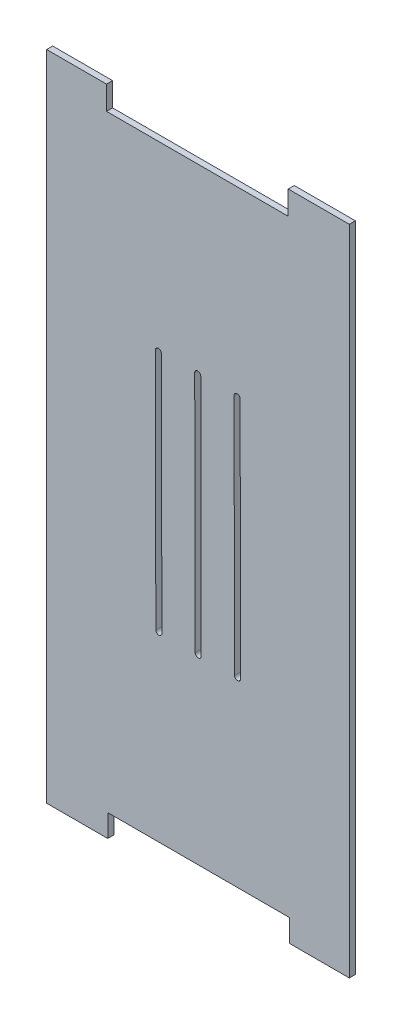
ISO-10303-21;
HEADER;
FILE_DESCRIPTION(('STEP AP214'),'2;1');
FILE_NAME('part.step','',(''),(''),'','','');
FILE_SCHEMA(('AUTOMOTIVE_DESIGN { 1 0 10303 214 1 1 1 1 }'));
ENDSEC;
DATA;
#1=APPLICATION_CONTEXT('core data for automotive mechanical design processes');
#2=APPLICATION_PROTOCOL_DEFINITION('international standard','automotive_design',2000,#1);
#3=PRODUCT_CONTEXT('',#1,'mechanical');
#4=PRODUCT('Part','Part','',(#3));
#5=PRODUCT_RELATED_PRODUCT_CATEGORY('part','',(#4));
#6=PRODUCT_DEFINITION_FORMATION('','',#4);
#7=PRODUCT_DEFINITION_CONTEXT('part definition',#1,'design');
#8=PRODUCT_DEFINITION('design','',#6,#7);
#9=PRODUCT_DEFINITION_SHAPE('','',#8);
#10=(LENGTH_UNIT() NAMED_UNIT(*) SI_UNIT(.MILLI.,.METRE.));
#11=(NAMED_UNIT(*) PLANE_ANGLE_UNIT() SI_UNIT($,.RADIAN.));
#12=(NAMED_UNIT(*) SI_UNIT($,.STERADIAN.) SOLID_ANGLE_UNIT());
#13=UNCERTAINTY_MEASURE_WITH_UNIT(LENGTH_MEASURE(1.E-05),#10,'distance_accuracy_value','');
#14=(GEOMETRIC_REPRESENTATION_CONTEXT(3) GLOBAL_UNCERTAINTY_ASSIGNED_CONTEXT((#13)) GLOBAL_UNIT_ASSIGNED_CONTEXT((#10,
#11,#12)) REPRESENTATION_CONTEXT('',''));
#15=CARTESIAN_POINT('',(0.,0.,0.));
#16=DIRECTION('',(0.,0.,1.));
#17=DIRECTION('',(1.,0.,0.));
#18=AXIS2_PLACEMENT_3D('',#15,#16,#17);
#19=CARTESIAN_POINT('',(0.,0.,5.));
#20=DIRECTION('',(0.,0.,-1.));
#21=DIRECTION('',(-1.,0.,0.));
#22=AXIS2_PLACEMENT_3D('',#19,#20,#21);
#23=PLANE('',#22);
#24=DIRECTION('',(0.00199600400794847,-0.999998007982016,0.));
#25=VECTOR('',#24,1.);
#26=CARTESIAN_POINT('',(235.300404181642,369.49500998998,5.));
#27=LINE('',#26,#25);
#28=CARTESIAN_POINT('',(235.300404181642,369.49500998998,5.));
#29=VERTEX_POINT('',#28);
#30=CARTESIAN_POINT('',(235.699605778448,169.49500998998,5.));
#31=VERTEX_POINT('',#30);
#32=EDGE_CURVE('E390',#29,#31,#27,.T.);
#33=ORIENTED_EDGE('',*,*,#32,.F.);
#34=CARTESIAN_POINT('',(237.800399201597,369.5,5.));
#35=DIRECTION('',(0.,0.,1.));
#36=DIRECTION('',(1.,0.,0.));
#37=AXIS2_PLACEMENT_3D('',#34,#35,#36);
#38=CIRCLE('',#37,2.50000000000006);
#39=CARTESIAN_POINT('',(240.300394221552,369.50499001002,5.));
#40=VERTEX_POINT('',#39);
#41=EDGE_CURVE('E57',#40,#29,#38,.T.);
#42=ORIENTED_EDGE('',*,*,#41,.F.);
#43=DIRECTION('',(0.00199600400794847,-0.999998007982016,0.));
#44=VECTOR('',#43,1.);
#45=CARTESIAN_POINT('',(240.300394221552,369.50499001002,5.));
#46=LINE('',#45,#44);
#47=CARTESIAN_POINT('',(240.699595818358,169.50499001002,5.));
#48=VERTEX_POINT('',#47);
#49=EDGE_CURVE('E397',#40,#48,#46,.T.);
#50=ORIENTED_EDGE('',*,*,#49,.T.);
#51=CARTESIAN_POINT('',(238.199600798403,169.5,5.));
#52=DIRECTION('',(0.,0.,1.));
#53=DIRECTION('',(1.,0.,0.));
#54=AXIS2_PLACEMENT_3D('',#51,#52,#53);
#55=CIRCLE('',#54,2.50000000000006);
#56=EDGE_CURVE('E393',#31,#48,#55,.T.);
#57=ORIENTED_EDGE('',*,*,#56,.F.);
#58=EDGE_LOOP('',(#33,#42,#50,#57));
#59=FACE_BOUND('',#58,.T.);
#60=DIRECTION('',(0.00199600400794847,-0.999998007982016,0.));
#61=VECTOR('',#60,1.);
#62=CARTESIAN_POINT('',(300.300404181642,369.49500998998,5.));
#63=LINE('',#62,#61);
#64=CARTESIAN_POINT('',(300.300404181642,369.49500998998,5.));
#65=VERTEX_POINT('',#64);
#66=CARTESIAN_POINT('',(300.699605778448,169.49500998998,5.));
#67=VERTEX_POINT('',#66);
#68=EDGE_CURVE('E415',#65,#67,#63,.T.);
#69=ORIENTED_EDGE('',*,*,#68,.F.);
#70=CARTESIAN_POINT('',(302.800399201597,369.5,5.));
#71=DIRECTION('',(0.,0.,1.));
#72=DIRECTION('',(1.,0.,0.));
#73=AXIS2_PLACEMENT_3D('',#70,#71,#72);
#74=CIRCLE('',#73,2.50000000000006);
#75=CARTESIAN_POINT('',(305.300394221552,369.50499001002,5.));
#76=VERTEX_POINT('',#75);
#77=EDGE_CURVE('E405',#76,#65,#74,.T.);
#78=ORIENTED_EDGE('',*,*,#77,.F.);
#79=DIRECTION('',(0.00199600400794847,-0.999998007982016,0.));
#80=VECTOR('',#79,1.);
#81=CARTESIAN_POINT('',(305.300394221552,369.50499001002,5.));
#82=LINE('',#81,#80);
#83=CARTESIAN_POINT('',(305.699595818358,169.50499001002,5.));
#84=VERTEX_POINT('',#83);
#85=EDGE_CURVE('E423',#76,#84,#82,.T.);
#86=ORIENTED_EDGE('',*,*,#85,.T.);
#87=CARTESIAN_POINT('',(303.199600798403,169.5,5.));
#88=DIRECTION('',(0.,0.,1.));
#89=DIRECTION('',(1.,0.,0.));
#90=AXIS2_PLACEMENT_3D('',#87,#88,#89);
#91=CIRCLE('',#90,2.50000000000006);
#92=EDGE_CURVE('E419',#67,#84,#91,.T.);
#93=ORIENTED_EDGE('',*,*,#92,.F.);
#94=EDGE_LOOP('',(#69,#78,#86,#93));
#95=FACE_BOUND('',#94,.T.);
#96=DIRECTION('',(0.00199600400794847,-0.999998007982016,0.));
#97=VECTOR('',#96,1.);
#98=CARTESIAN_POINT('',(267.800404181642,369.49500998998,5.));
#99=LINE('',#98,#97);
#100=CARTESIAN_POINT('',(267.800404181642,369.49500998998,5.));
#101=VERTEX_POINT('',#100);
#102=CARTESIAN_POINT('',(268.199605778448,169.49500998998,5.));
#103=VERTEX_POINT('',#102);
#104=EDGE_CURVE('E443',#101,#103,#99,.T.);
#105=ORIENTED_EDGE('',*,*,#104,.F.);
#106=CARTESIAN_POINT('',(270.300399201597,369.5,5.));
#107=DIRECTION('',(0.,0.,1.));
#108=DIRECTION('',(1.,0.,0.));
#109=AXIS2_PLACEMENT_3D('',#106,#107,#108);
#110=CIRCLE('',#109,2.50000000000006);
#111=CARTESIAN_POINT('',(272.800394221552,369.50499001002,5.));
#112=VERTEX_POINT('',#111);
#113=EDGE_CURVE('E431',#112,#101,#110,.T.);
#114=ORIENTED_EDGE('',*,*,#113,.F.);
#115=DIRECTION('',(0.00199600400794847,-0.999998007982016,0.));
#116=VECTOR('',#115,1.);
#117=CARTESIAN_POINT('',(272.800394221552,369.50499001002,5.));
#118=LINE('',#117,#116);
#119=CARTESIAN_POINT('',(273.199595818358,169.50499001002,5.));
#120=VERTEX_POINT('',#119);
#121=EDGE_CURVE('E451',#112,#120,#118,.T.);
#122=ORIENTED_EDGE('',*,*,#121,.T.);
#123=CARTESIAN_POINT('',(270.699600798403,169.5,5.));
#124=DIRECTION('',(0.,0.,1.));
#125=DIRECTION('',(1.,0.,0.));
#126=AXIS2_PLACEMENT_3D('',#123,#124,#125);
#127=CIRCLE('',#126,2.50000000000006);
#128=EDGE_CURVE('E447',#103,#120,#127,.T.);
#129=ORIENTED_EDGE('',*,*,#128,.F.);
#130=EDGE_LOOP('',(#105,#114,#122,#129));
#131=FACE_BOUND('',#130,.T.);
#132=DIRECTION('',(0.,-1.,0.));
#133=VECTOR('',#132,1.);
#134=CARTESIAN_POINT('',(145.5,539.5,5.));
#135=LINE('',#134,#133);
#136=CARTESIAN_POINT('',(145.5,539.5,5.));
#137=VERTEX_POINT('',#136);
#138=CARTESIAN_POINT('',(145.5,0.500000000000056,5.));
#139=VERTEX_POINT('',#138);
#140=EDGE_CURVE('E301',#137,#139,#135,.T.);
#141=ORIENTED_EDGE('',*,*,#140,.T.);
#142=DIRECTION('',(1.,0.,0.));
#143=VECTOR('',#142,1.);
#144=CARTESIAN_POINT('',(145.5,0.500000000000056,5.));
#145=LINE('',#144,#143);
#146=CARTESIAN_POINT('',(196.,0.500000000000056,5.));
#147=VERTEX_POINT('',#146);
#148=EDGE_CURVE('E209',#139,#147,#145,.T.);
#149=ORIENTED_EDGE('',*,*,#148,.T.);
#150=DIRECTION('',(0.,-1.,0.));
#151=VECTOR('',#150,1.);
#152=CARTESIAN_POINT('',(196.,-0.999999999999779,5.));
#153=LINE('',#152,#151);
#154=CARTESIAN_POINT('',(196.,19.0000000000002,5.));
#155=VERTEX_POINT('',#154);
#156=EDGE_CURVE('E300',#155,#147,#153,.T.);
#157=ORIENTED_EDGE('',*,*,#156,.F.);
#158=DIRECTION('',(-1.,0.,0.));
#159=VECTOR('',#158,1.);
#160=CARTESIAN_POINT('',(346.,19.0000000000002,5.));
#161=LINE('',#160,#159);
#162=CARTESIAN_POINT('',(346.,19.0000000000002,5.));
#163=VERTEX_POINT('',#162);
#164=EDGE_CURVE('E311',#163,#155,#161,.T.);
#165=ORIENTED_EDGE('',*,*,#164,.F.);
#166=DIRECTION('',(0.,1.,0.));
#167=VECTOR('',#166,1.);
#168=CARTESIAN_POINT('',(346.,-0.999999999999779,5.));
#169=LINE('',#168,#167);
#170=CARTESIAN_POINT('',(346.,0.500000000000056,5.));
#171=VERTEX_POINT('',#170);
#172=EDGE_CURVE('E316',#171,#163,#169,.T.);
#173=ORIENTED_EDGE('',*,*,#172,.F.);
#174=DIRECTION('',(1.,0.,0.));
#175=VECTOR('',#174,1.);
#176=CARTESIAN_POINT('',(0.,0.500000000000056,5.));
#177=LINE('',#176,#175);
#178=CARTESIAN_POINT('',(395.5,0.500000000000056,5.));
#179=VERTEX_POINT('',#178);
#180=EDGE_CURVE('E232',#171,#179,#177,.T.);
#181=ORIENTED_EDGE('',*,*,#180,.T.);
#182=DIRECTION('',(0.,1.,0.));
#183=VECTOR('',#182,1.);
#184=CARTESIAN_POINT('',(395.5,539.5,5.));
#185=LINE('',#184,#183);
#186=CARTESIAN_POINT('',(395.5,539.5,5.));
#187=VERTEX_POINT('',#186);
#188=EDGE_CURVE('E303',#179,#187,#185,.T.);
#189=ORIENTED_EDGE('',*,*,#188,.T.);
#190=DIRECTION('',(-1.,0.,0.));
#191=VECTOR('',#190,1.);
#192=CARTESIAN_POINT('',(145.5,539.5,5.));
#193=LINE('',#192,#191);
#194=CARTESIAN_POINT('',(345.,539.5,5.));
#195=VERTEX_POINT('',#194);
#196=EDGE_CURVE('E226',#187,#195,#193,.T.);
#197=ORIENTED_EDGE('',*,*,#196,.T.);
#198=DIRECTION('',(0.,1.,0.));
#199=VECTOR('',#198,1.);
#200=CARTESIAN_POINT('',(345.,540.,5.));
#201=LINE('',#200,#199);
#202=CARTESIAN_POINT('',(345.,520.,5.));
#203=VERTEX_POINT('',#202);
#204=EDGE_CURVE('E336',#203,#195,#201,.T.);
#205=ORIENTED_EDGE('',*,*,#204,.F.);
#206=DIRECTION('',(1.,0.,0.));
#207=VECTOR('',#206,1.);
#208=CARTESIAN_POINT('',(195.,520.,5.));
#209=LINE('',#208,#207);
#210=CARTESIAN_POINT('',(195.,520.,5.));
#211=VERTEX_POINT('',#210);
#212=EDGE_CURVE('E332',#211,#203,#209,.T.);
#213=ORIENTED_EDGE('',*,*,#212,.F.);
#214=DIRECTION('',(0.,-1.,0.));
#215=VECTOR('',#214,1.);
#216=CARTESIAN_POINT('',(195.,540.,5.));
#217=LINE('',#216,#215);
#218=CARTESIAN_POINT('',(195.,539.5,5.));
#219=VERTEX_POINT('',#218);
#220=EDGE_CURVE('E328',#219,#211,#217,.T.);
#221=ORIENTED_EDGE('',*,*,#220,.F.);
#222=DIRECTION('',(-1.,0.,0.));
#223=VECTOR('',#222,1.);
#224=CARTESIAN_POINT('',(0.,539.5,5.));
#225=LINE('',#224,#223);
#226=EDGE_CURVE('E238',#219,#137,#225,.T.);
#227=ORIENTED_EDGE('',*,*,#226,.T.);
#228=EDGE_LOOP('',(#141,#149,#157,#165,#173,#181,#189,#197,#205,#213,#221,#227));
#229=FACE_BOUND('',#228,.T.);
#230=ADVANCED_FACE('F41',(#59,#95,#131,#229),#23,.F.);
#231=CARTESIAN_POINT('',(0.,0.,0.));
#232=DIRECTION('',(0.,0.,-1.));
#233=DIRECTION('',(-1.,0.,0.));
#234=AXIS2_PLACEMENT_3D('',#231,#232,#233);
#235=PLANE('',#234);
#236=CARTESIAN_POINT('',(237.800399201597,369.5,0.));
#237=DIRECTION('',(0.,0.,-1.));
#238=DIRECTION('',(-1.,0.,0.));
#239=AXIS2_PLACEMENT_3D('',#236,#237,#238);
#240=CIRCLE('',#239,2.50000000000006);
#241=CARTESIAN_POINT('',(235.300404181642,369.49500998998,0.));
#242=VERTEX_POINT('',#241);
#243=CARTESIAN_POINT('',(240.300394221552,369.50499001002,0.));
#244=VERTEX_POINT('',#243);
#245=EDGE_CURVE('E292',#242,#244,#240,.T.);
#246=ORIENTED_EDGE('',*,*,#245,.F.);
#247=DIRECTION('',(-0.00199600400794847,0.999998007982016,0.));
#248=VECTOR('',#247,1.);
#249=CARTESIAN_POINT('',(236.036978789019,0.471131694189736,0.));
#250=LINE('',#249,#248);
#251=CARTESIAN_POINT('',(235.699605778448,169.49500998998,0.));
#252=VERTEX_POINT('',#251);
#253=EDGE_CURVE('E282',#252,#242,#250,.T.);
#254=ORIENTED_EDGE('',*,*,#253,.F.);
#255=CARTESIAN_POINT('',(238.199600798403,169.5,0.));
#256=DIRECTION('',(0.,0.,-1.));
#257=DIRECTION('',(-1.,0.,0.));
#258=AXIS2_PLACEMENT_3D('',#255,#256,#257);
#259=CIRCLE('',#258,2.50000000000006);
#260=CARTESIAN_POINT('',(240.699595818358,169.50499001002,0.));
#261=VERTEX_POINT('',#260);
#262=EDGE_CURVE('E285',#261,#252,#259,.T.);
#263=ORIENTED_EDGE('',*,*,#262,.F.);
#264=DIRECTION('',(-0.00199600400794847,0.999998007982016,0.));
#265=VECTOR('',#264,1.);
#266=CARTESIAN_POINT('',(241.036968828929,0.481111714229478,0.));
#267=LINE('',#266,#265);
#268=EDGE_CURVE('E288',#261,#244,#267,.T.);
#269=ORIENTED_EDGE('',*,*,#268,.T.);
#270=EDGE_LOOP('',(#246,#254,#263,#269));
#271=FACE_BOUND('',#270,.T.);
#272=CARTESIAN_POINT('',(302.800399201597,369.5,0.));
#273=DIRECTION('',(0.,0.,-1.));
#274=DIRECTION('',(-1.,0.,0.));
#275=AXIS2_PLACEMENT_3D('',#272,#273,#274);
#276=CIRCLE('',#275,2.50000000000006);
#277=CARTESIAN_POINT('',(300.300404181642,369.49500998998,0.));
#278=VERTEX_POINT('',#277);
#279=CARTESIAN_POINT('',(305.300394221552,369.50499001002,0.));
#280=VERTEX_POINT('',#279);
#281=EDGE_CURVE('E279',#278,#280,#276,.T.);
#282=ORIENTED_EDGE('',*,*,#281,.F.);
#283=DIRECTION('',(-0.00199600400794847,0.999998007982016,0.));
#284=VECTOR('',#283,1.);
#285=CARTESIAN_POINT('',(301.036719826939,0.600871696261454,0.));
#286=LINE('',#285,#284);
#287=CARTESIAN_POINT('',(300.699605778448,169.49500998998,0.));
#288=VERTEX_POINT('',#287);
#289=EDGE_CURVE('E268',#288,#278,#286,.T.);
#290=ORIENTED_EDGE('',*,*,#289,.F.);
#291=CARTESIAN_POINT('',(303.199600798403,169.5,0.));
#292=DIRECTION('',(0.,0.,-1.));
#293=DIRECTION('',(-1.,0.,0.));
#294=AXIS2_PLACEMENT_3D('',#291,#292,#293);
#295=CIRCLE('',#294,2.50000000000006);
#296=CARTESIAN_POINT('',(305.699595818358,169.50499001002,0.));
#297=VERTEX_POINT('',#296);
#298=EDGE_CURVE('E271',#297,#288,#295,.T.);
#299=ORIENTED_EDGE('',*,*,#298,.F.);
#300=DIRECTION('',(-0.00199600400794847,0.999998007982016,0.));
#301=VECTOR('',#300,1.);
#302=CARTESIAN_POINT('',(306.036709866849,0.610851716301197,0.));
#303=LINE('',#302,#301);
#304=EDGE_CURVE('E275',#297,#280,#303,.T.);
#305=ORIENTED_EDGE('',*,*,#304,.T.);
#306=EDGE_LOOP('',(#282,#290,#299,#305));
#307=FACE_BOUND('',#306,.T.);
#308=CARTESIAN_POINT('',(270.300399201597,369.5,0.));
#309=DIRECTION('',(0.,0.,-1.));
#310=DIRECTION('',(-1.,0.,0.));
#311=AXIS2_PLACEMENT_3D('',#308,#309,#310);
#312=CIRCLE('',#311,2.50000000000006);
#313=CARTESIAN_POINT('',(267.800404181642,369.49500998998,0.));
#314=VERTEX_POINT('',#313);
#315=CARTESIAN_POINT('',(272.800394221552,369.50499001002,0.));
#316=VERTEX_POINT('',#315);
#317=EDGE_CURVE('E265',#314,#316,#312,.T.);
#318=ORIENTED_EDGE('',*,*,#317,.F.);
#319=DIRECTION('',(-0.00199600400794847,0.999998007982016,0.));
#320=VECTOR('',#319,1.);
#321=CARTESIAN_POINT('',(268.536849307979,0.536001695225595,0.));
#322=LINE('',#321,#320);
#323=CARTESIAN_POINT('',(268.199605778448,169.49500998998,0.));
#324=VERTEX_POINT('',#323);
#325=EDGE_CURVE('E254',#324,#314,#322,.T.);
#326=ORIENTED_EDGE('',*,*,#325,.F.);
#327=CARTESIAN_POINT('',(270.699600798403,169.5,0.));
#328=DIRECTION('',(0.,0.,-1.));
#329=DIRECTION('',(-1.,0.,0.));
#330=AXIS2_PLACEMENT_3D('',#327,#328,#329);
#331=CIRCLE('',#330,2.50000000000006);
#332=CARTESIAN_POINT('',(273.199595818358,169.50499001002,0.));
#333=VERTEX_POINT('',#332);
#334=EDGE_CURVE('E257',#333,#324,#331,.T.);
#335=ORIENTED_EDGE('',*,*,#334,.F.);
#336=DIRECTION('',(-0.00199600400794847,0.999998007982016,0.));
#337=VECTOR('',#336,1.);
#338=CARTESIAN_POINT('',(273.536839347889,0.545981715265337,0.));
#339=LINE('',#338,#337);
#340=EDGE_CURVE('E261',#333,#316,#339,.T.);
#341=ORIENTED_EDGE('',*,*,#340,.T.);
#342=EDGE_LOOP('',(#318,#326,#335,#341));
#343=FACE_BOUND('',#342,.T.);
#344=DIRECTION('',(-1.,0.,0.));
#345=VECTOR('',#344,1.);
#346=CARTESIAN_POINT('',(0.,0.499999999999945,0.));
#347=LINE('',#346,#345);
#348=CARTESIAN_POINT('',(196.,0.499999999999945,0.));
#349=VERTEX_POINT('',#348);
#350=CARTESIAN_POINT('',(145.5,0.500000000000056,0.));
#351=VERTEX_POINT('',#350);
#352=EDGE_CURVE('E206',#349,#351,#347,.T.);
#353=ORIENTED_EDGE('',*,*,#352,.T.);
#354=DIRECTION('',(0.,-1.,0.));
#355=VECTOR('',#354,1.);
#356=CARTESIAN_POINT('',(145.5,539.5,0.));
#357=LINE('',#356,#355);
#358=CARTESIAN_POINT('',(145.5,539.5,0.));
#359=VERTEX_POINT('',#358);
#360=EDGE_CURVE('E219',#359,#351,#357,.T.);
#361=ORIENTED_EDGE('',*,*,#360,.F.);
#362=DIRECTION('',(-1.,0.,0.));
#363=VECTOR('',#362,1.);
#364=CARTESIAN_POINT('',(145.5,539.5,0.));
#365=LINE('',#364,#363);
#366=CARTESIAN_POINT('',(195.,539.5,0.));
#367=VERTEX_POINT('',#366);
#368=EDGE_CURVE('E215',#367,#359,#365,.T.);
#369=ORIENTED_EDGE('',*,*,#368,.F.);
#370=DIRECTION('',(0.,1.,0.));
#371=VECTOR('',#370,1.);
#372=CARTESIAN_POINT('',(195.,0.,0.));
#373=LINE('',#372,#371);
#374=CARTESIAN_POINT('',(195.,520.,0.));
#375=VERTEX_POINT('',#374);
#376=EDGE_CURVE('E241',#375,#367,#373,.T.);
#377=ORIENTED_EDGE('',*,*,#376,.F.);
#378=DIRECTION('',(-1.,0.,0.));
#379=VECTOR('',#378,1.);
#380=CARTESIAN_POINT('',(0.,520.,0.));
#381=LINE('',#380,#379);
#382=CARTESIAN_POINT('',(345.,520.,0.));
#383=VERTEX_POINT('',#382);
#384=EDGE_CURVE('E248',#383,#375,#381,.T.);
#385=ORIENTED_EDGE('',*,*,#384,.F.);
#386=DIRECTION('',(0.,-1.,0.));
#387=VECTOR('',#386,1.);
#388=CARTESIAN_POINT('',(345.,0.,0.));
#389=LINE('',#388,#387);
#390=CARTESIAN_POINT('',(345.,539.5,0.));
#391=VERTEX_POINT('',#390);
#392=EDGE_CURVE('E344',#391,#383,#389,.T.);
#393=ORIENTED_EDGE('',*,*,#392,.F.);
#394=DIRECTION('',(1.,0.,0.));
#395=VECTOR('',#394,1.);
#396=CARTESIAN_POINT('',(540.,539.5,0.));
#397=LINE('',#396,#395);
#398=CARTESIAN_POINT('',(395.5,539.5,0.));
#399=VERTEX_POINT('',#398);
#400=EDGE_CURVE('E233',#391,#399,#397,.T.);
#401=ORIENTED_EDGE('',*,*,#400,.T.);
#402=DIRECTION('',(0.,1.,0.));
#403=VECTOR('',#402,1.);
#404=CARTESIAN_POINT('',(395.5,539.5,0.));
#405=LINE('',#404,#403);
#406=CARTESIAN_POINT('',(395.5,0.500000000000056,0.));
#407=VERTEX_POINT('',#406);
#408=EDGE_CURVE('E361',#407,#399,#405,.T.);
#409=ORIENTED_EDGE('',*,*,#408,.F.);
#410=DIRECTION('',(1.,0.,0.));
#411=VECTOR('',#410,1.);
#412=CARTESIAN_POINT('',(145.5,0.500000000000056,0.));
#413=LINE('',#412,#411);
#414=CARTESIAN_POINT('',(346.,0.500000000000056,0.));
#415=VERTEX_POINT('',#414);
#416=EDGE_CURVE('E225',#415,#407,#413,.T.);
#417=ORIENTED_EDGE('',*,*,#416,.F.);
#418=DIRECTION('',(0.,-1.,0.));
#419=VECTOR('',#418,1.);
#420=CARTESIAN_POINT('',(346.,0.,0.));
#421=LINE('',#420,#419);
#422=CARTESIAN_POINT('',(346.,19.0000000000002,0.));
#423=VERTEX_POINT('',#422);
#424=EDGE_CURVE('E324',#423,#415,#421,.T.);
#425=ORIENTED_EDGE('',*,*,#424,.F.);
#426=DIRECTION('',(1.,0.,0.));
#427=VECTOR('',#426,1.);
#428=CARTESIAN_POINT('',(0.,19.0000000000002,0.));
#429=LINE('',#428,#427);
#430=CARTESIAN_POINT('',(196.,19.0000000000002,0.));
#431=VERTEX_POINT('',#430);
#432=EDGE_CURVE('E251',#431,#423,#429,.T.);
#433=ORIENTED_EDGE('',*,*,#432,.F.);
#434=DIRECTION('',(0.,1.,0.));
#435=VECTOR('',#434,1.);
#436=CARTESIAN_POINT('',(196.,0.,0.));
#437=LINE('',#436,#435);
#438=EDGE_CURVE('E230',#349,#431,#437,.T.);
#439=ORIENTED_EDGE('',*,*,#438,.F.);
#440=EDGE_LOOP('',(#353,#361,#369,#377,#385,#393,#401,#409,#417,#425,#433,#439));
#441=FACE_BOUND('',#440,.T.);
#442=ADVANCED_FACE('F43',(#271,#307,#343,#441),#235,.T.);
#443=CARTESIAN_POINT('',(195.,540.,-5.));
#444=DIRECTION('',(-1.,0.,0.));
#445=DIRECTION('',(0.,0.,1.));
#446=AXIS2_PLACEMENT_3D('',#443,#444,#445);
#447=PLANE('',#446);
#448=DIRECTION('',(0.,0.,-1.));
#449=VECTOR('',#448,1.);
#450=CARTESIAN_POINT('',(195.,539.5,-5.));
#451=LINE('',#450,#449);
#452=EDGE_CURVE('E355',#219,#367,#451,.T.);
#453=ORIENTED_EDGE('',*,*,#452,.F.);
#454=ORIENTED_EDGE('',*,*,#220,.T.);
#455=DIRECTION('',(0.,0.,1.));
#456=VECTOR('',#455,1.);
#457=CARTESIAN_POINT('',(195.,520.,-5.));
#458=LINE('',#457,#456);
#459=EDGE_CURVE('E340',#375,#211,#458,.T.);
#460=ORIENTED_EDGE('',*,*,#459,.F.);
#461=ORIENTED_EDGE('',*,*,#376,.T.);
#462=EDGE_LOOP('',(#453,#454,#460,#461));
#463=FACE_BOUND('',#462,.T.);
#464=ADVANCED_FACE('F354',(#463),#447,.F.);
#465=CARTESIAN_POINT('',(345.,540.,-5.));
#466=DIRECTION('',(1.,0.,0.));
#467=DIRECTION('',(0.,0.,-1.));
#468=AXIS2_PLACEMENT_3D('',#465,#466,#467);
#469=PLANE('',#468);
#470=DIRECTION('',(0.,0.,1.));
#471=VECTOR('',#470,1.);
#472=CARTESIAN_POINT('',(345.,539.5,-5.));
#473=LINE('',#472,#471);
#474=EDGE_CURVE('E11',#391,#195,#473,.T.);
#475=ORIENTED_EDGE('',*,*,#474,.F.);
#476=ORIENTED_EDGE('',*,*,#392,.T.);
#477=DIRECTION('',(0.,0.,1.));
#478=VECTOR('',#477,1.);
#479=CARTESIAN_POINT('',(345.,520.,-5.));
#480=LINE('',#479,#478);
#481=EDGE_CURVE('E341',#383,#203,#480,.T.);
#482=ORIENTED_EDGE('',*,*,#481,.T.);
#483=ORIENTED_EDGE('',*,*,#204,.T.);
#484=EDGE_LOOP('',(#475,#476,#482,#483));
#485=FACE_BOUND('',#484,.T.);
#486=ADVANCED_FACE('F492',(#485),#469,.F.);
#487=CARTESIAN_POINT('',(346.,-0.999999999999779,-5.));
#488=DIRECTION('',(1.,0.,0.));
#489=DIRECTION('',(0.,0.,-1.));
#490=AXIS2_PLACEMENT_3D('',#487,#488,#489);
#491=PLANE('',#490);
#492=DIRECTION('',(0.,0.,-1.));
#493=VECTOR('',#492,1.);
#494=CARTESIAN_POINT('',(346.,0.500000000000056,-5.));
#495=LINE('',#494,#493);
#496=EDGE_CURVE('E378',#171,#415,#495,.T.);
#497=ORIENTED_EDGE('',*,*,#496,.F.);
#498=ORIENTED_EDGE('',*,*,#172,.T.);
#499=DIRECTION('',(0.,0.,1.));
#500=VECTOR('',#499,1.);
#501=CARTESIAN_POINT('',(346.,19.0000000000002,-5.));
#502=LINE('',#501,#500);
#503=EDGE_CURVE('E310',#423,#163,#502,.T.);
#504=ORIENTED_EDGE('',*,*,#503,.F.);
#505=ORIENTED_EDGE('',*,*,#424,.T.);
#506=EDGE_LOOP('',(#497,#498,#504,#505));
#507=FACE_BOUND('',#506,.T.);
#508=ADVANCED_FACE('F473',(#507),#491,.F.);
#509=CARTESIAN_POINT('',(196.,-0.999999999999779,-5.));
#510=DIRECTION('',(-1.,0.,0.));
#511=DIRECTION('',(0.,0.,1.));
#512=AXIS2_PLACEMENT_3D('',#509,#510,#511);
#513=PLANE('',#512);
#514=DIRECTION('',(0.,0.,1.));
#515=VECTOR('',#514,1.);
#516=CARTESIAN_POINT('',(196.,0.500000000000056,-5.));
#517=LINE('',#516,#515);
#518=EDGE_CURVE('E50',#349,#147,#517,.T.);
#519=ORIENTED_EDGE('',*,*,#518,.F.);
#520=ORIENTED_EDGE('',*,*,#438,.T.);
#521=DIRECTION('',(0.,0.,1.));
#522=VECTOR('',#521,1.);
#523=CARTESIAN_POINT('',(196.,19.0000000000002,-5.));
#524=LINE('',#523,#522);
#525=EDGE_CURVE('E307',#431,#155,#524,.T.);
#526=ORIENTED_EDGE('',*,*,#525,.T.);
#527=ORIENTED_EDGE('',*,*,#156,.T.);
#528=EDGE_LOOP('',(#519,#520,#526,#527));
#529=FACE_BOUND('',#528,.T.);
#530=ADVANCED_FACE('F305',(#529),#513,.F.);
#531=CARTESIAN_POINT('',(195.,520.,-5.));
#532=DIRECTION('',(0.,-1.,0.));
#533=DIRECTION('',(0.,0.,-1.));
#534=AXIS2_PLACEMENT_3D('',#531,#532,#533);
#535=PLANE('',#534);
#536=ORIENTED_EDGE('',*,*,#384,.T.);
#537=ORIENTED_EDGE('',*,*,#459,.T.);
#538=ORIENTED_EDGE('',*,*,#212,.T.);
#539=ORIENTED_EDGE('',*,*,#481,.F.);
#540=EDGE_LOOP('',(#536,#537,#538,#539));
#541=FACE_BOUND('',#540,.T.);
#542=ADVANCED_FACE('F495',(#541),#535,.F.);
#543=CARTESIAN_POINT('',(346.,19.0000000000002,-5.));
#544=DIRECTION('',(0.,1.,0.));
#545=DIRECTION('',(0.,0.,1.));
#546=AXIS2_PLACEMENT_3D('',#543,#544,#545);
#547=PLANE('',#546);
#548=ORIENTED_EDGE('',*,*,#432,.T.);
#549=ORIENTED_EDGE('',*,*,#503,.T.);
#550=ORIENTED_EDGE('',*,*,#164,.T.);
#551=ORIENTED_EDGE('',*,*,#525,.F.);
#552=EDGE_LOOP('',(#548,#549,#550,#551));
#553=FACE_BOUND('',#552,.T.);
#554=ADVANCED_FACE('F476',(#553),#547,.F.);
#555=CARTESIAN_POINT('',(270.300399201597,369.5,-5.));
#556=DIRECTION('',(0.,0.,1.));
#557=DIRECTION('',(1.,0.,0.));
#558=AXIS2_PLACEMENT_3D('',#555,#556,#557);
#559=CYLINDRICAL_SURFACE('',#558,2.50000000000006);
#560=ORIENTED_EDGE('',*,*,#317,.T.);
#561=DIRECTION('',(0.,0.,1.));
#562=VECTOR('',#561,1.);
#563=CARTESIAN_POINT('',(272.800394221552,369.50499001002,-5.));
#564=LINE('',#563,#562);
#565=EDGE_CURVE('E456',#316,#112,#564,.T.);
#566=ORIENTED_EDGE('',*,*,#565,.T.);
#567=ORIENTED_EDGE('',*,*,#113,.T.);
#568=DIRECTION('',(0.,0.,1.));
#569=VECTOR('',#568,1.);
#570=CARTESIAN_POINT('',(267.800404181642,369.49500998998,-5.));
#571=LINE('',#570,#569);
#572=EDGE_CURVE('E455',#314,#101,#571,.T.);
#573=ORIENTED_EDGE('',*,*,#572,.F.);
#574=EDGE_LOOP('',(#560,#566,#567,#573));
#575=FACE_BOUND('',#574,.T.);
#576=ADVANCED_FACE('F529',(#575),#559,.F.);
#577=CARTESIAN_POINT('',(272.800394221552,369.50499001002,-5.));
#578=DIRECTION('',(-0.999998007982016,-0.00199600400794847,0.));
#579=DIRECTION('',(0.00199600400794847,-0.999998007982016,0.));
#580=AXIS2_PLACEMENT_3D('',#577,#578,#579);
#581=PLANE('',#580);
#582=DIRECTION('',(0.,0.,1.));
#583=VECTOR('',#582,1.);
#584=CARTESIAN_POINT('',(273.199595818358,169.50499001002,-5.));
#585=LINE('',#584,#583);
#586=EDGE_CURVE('E459',#333,#120,#585,.T.);
#587=ORIENTED_EDGE('',*,*,#586,.T.);
#588=ORIENTED_EDGE('',*,*,#121,.F.);
#589=ORIENTED_EDGE('',*,*,#565,.F.);
#590=ORIENTED_EDGE('',*,*,#340,.F.);
#591=EDGE_LOOP('',(#587,#588,#589,#590));
#592=FACE_BOUND('',#591,.T.);
#593=ADVANCED_FACE('F534',(#592),#581,.T.);
#594=CARTESIAN_POINT('',(270.699600798403,169.5,-5.));
#595=DIRECTION('',(0.,0.,1.));
#596=DIRECTION('',(1.,0.,0.));
#597=AXIS2_PLACEMENT_3D('',#594,#595,#596);
#598=CYLINDRICAL_SURFACE('',#597,2.50000000000006);
#599=ORIENTED_EDGE('',*,*,#334,.T.);
#600=DIRECTION('',(0.,0.,1.));
#601=VECTOR('',#600,1.);
#602=CARTESIAN_POINT('',(268.199605778448,169.49500998998,-5.));
#603=LINE('',#602,#601);
#604=EDGE_CURVE('E462',#324,#103,#603,.T.);
#605=ORIENTED_EDGE('',*,*,#604,.T.);
#606=ORIENTED_EDGE('',*,*,#128,.T.);
#607=ORIENTED_EDGE('',*,*,#586,.F.);
#608=EDGE_LOOP('',(#599,#605,#606,#607));
#609=FACE_BOUND('',#608,.T.);
#610=ADVANCED_FACE('F540',(#609),#598,.F.);
#611=CARTESIAN_POINT('',(267.800404181642,369.49500998998,-5.));
#612=DIRECTION('',(-0.999998007982016,-0.00199600400794847,0.));
#613=DIRECTION('',(0.00199600400794847,-0.999998007982016,0.));
#614=AXIS2_PLACEMENT_3D('',#611,#612,#613);
#615=PLANE('',#614);
#616=ORIENTED_EDGE('',*,*,#325,.T.);
#617=ORIENTED_EDGE('',*,*,#572,.T.);
#618=ORIENTED_EDGE('',*,*,#104,.T.);
#619=ORIENTED_EDGE('',*,*,#604,.F.);
#620=EDGE_LOOP('',(#616,#617,#618,#619));
#621=FACE_BOUND('',#620,.T.);
#622=ADVANCED_FACE('F536',(#621),#615,.F.);
#623=CARTESIAN_POINT('',(302.800399201597,369.5,-5.));
#624=DIRECTION('',(0.,0.,1.));
#625=DIRECTION('',(1.,0.,0.));
#626=AXIS2_PLACEMENT_3D('',#623,#624,#625);
#627=CYLINDRICAL_SURFACE('',#626,2.50000000000006);
#628=ORIENTED_EDGE('',*,*,#281,.T.);
#629=DIRECTION('',(0.,0.,1.));
#630=VECTOR('',#629,1.);
#631=CARTESIAN_POINT('',(305.300394221552,369.50499001002,-5.));
#632=LINE('',#631,#630);
#633=EDGE_CURVE('E428',#280,#76,#632,.T.);
#634=ORIENTED_EDGE('',*,*,#633,.T.);
#635=ORIENTED_EDGE('',*,*,#77,.T.);
#636=DIRECTION('',(0.,0.,1.));
#637=VECTOR('',#636,1.);
#638=CARTESIAN_POINT('',(300.300404181642,369.49500998998,-5.));
#639=LINE('',#638,#637);
#640=EDGE_CURVE('E427',#278,#65,#639,.T.);
#641=ORIENTED_EDGE('',*,*,#640,.F.);
#642=EDGE_LOOP('',(#628,#634,#635,#641));
#643=FACE_BOUND('',#642,.T.);
#644=ADVANCED_FACE('F539',(#643),#627,.F.);
#645=CARTESIAN_POINT('',(305.300394221552,369.50499001002,-5.));
#646=DIRECTION('',(-0.999998007982016,-0.00199600400794847,0.));
#647=DIRECTION('',(0.00199600400794847,-0.999998007982016,0.));
#648=AXIS2_PLACEMENT_3D('',#645,#646,#647);
#649=PLANE('',#648);
#650=DIRECTION('',(0.,0.,1.));
#651=VECTOR('',#650,1.);
#652=CARTESIAN_POINT('',(305.699595818358,169.50499001002,-5.));
#653=LINE('',#652,#651);
#654=EDGE_CURVE('E432',#297,#84,#653,.T.);
#655=ORIENTED_EDGE('',*,*,#654,.T.);
#656=ORIENTED_EDGE('',*,*,#85,.F.);
#657=ORIENTED_EDGE('',*,*,#633,.F.);
#658=ORIENTED_EDGE('',*,*,#304,.F.);
#659=EDGE_LOOP('',(#655,#656,#657,#658));
#660=FACE_BOUND('',#659,.T.);
#661=ADVANCED_FACE('F550',(#660),#649,.T.);
#662=CARTESIAN_POINT('',(303.199600798403,169.5,-5.));
#663=DIRECTION('',(0.,0.,1.));
#664=DIRECTION('',(1.,0.,0.));
#665=AXIS2_PLACEMENT_3D('',#662,#663,#664);
#666=CYLINDRICAL_SURFACE('',#665,2.50000000000006);
#667=ORIENTED_EDGE('',*,*,#298,.T.);
#668=DIRECTION('',(0.,0.,1.));
#669=VECTOR('',#668,1.);
#670=CARTESIAN_POINT('',(300.699605778448,169.49500998998,-5.));
#671=LINE('',#670,#669);
#672=EDGE_CURVE('E435',#288,#67,#671,.T.);
#673=ORIENTED_EDGE('',*,*,#672,.T.);
#674=ORIENTED_EDGE('',*,*,#92,.T.);
#675=ORIENTED_EDGE('',*,*,#654,.F.);
#676=EDGE_LOOP('',(#667,#673,#674,#675));
#677=FACE_BOUND('',#676,.T.);
#678=ADVANCED_FACE('F556',(#677),#666,.F.);
#679=CARTESIAN_POINT('',(300.300404181642,369.49500998998,-5.));
#680=DIRECTION('',(-0.999998007982016,-0.00199600400794847,0.));
#681=DIRECTION('',(0.00199600400794847,-0.999998007982016,0.));
#682=AXIS2_PLACEMENT_3D('',#679,#680,#681);
#683=PLANE('',#682);
#684=ORIENTED_EDGE('',*,*,#289,.T.);
#685=ORIENTED_EDGE('',*,*,#640,.T.);
#686=ORIENTED_EDGE('',*,*,#68,.T.);
#687=ORIENTED_EDGE('',*,*,#672,.F.);
#688=EDGE_LOOP('',(#684,#685,#686,#687));
#689=FACE_BOUND('',#688,.T.);
#690=ADVANCED_FACE('F552',(#689),#683,.F.);
#691=CARTESIAN_POINT('',(237.800399201597,369.5,-5.));
#692=DIRECTION('',(0.,0.,1.));
#693=DIRECTION('',(1.,0.,0.));
#694=AXIS2_PLACEMENT_3D('',#691,#692,#693);
#695=CYLINDRICAL_SURFACE('',#694,2.50000000000006);
#696=ORIENTED_EDGE('',*,*,#245,.T.);
#697=DIRECTION('',(0.,0.,1.));
#698=VECTOR('',#697,1.);
#699=CARTESIAN_POINT('',(240.300394221552,369.50499001002,-5.));
#700=LINE('',#699,#698);
#701=EDGE_CURVE('E402',#244,#40,#700,.T.);
#702=ORIENTED_EDGE('',*,*,#701,.T.);
#703=ORIENTED_EDGE('',*,*,#41,.T.);
#704=DIRECTION('',(0.,0.,1.));
#705=VECTOR('',#704,1.);
#706=CARTESIAN_POINT('',(235.300404181642,369.49500998998,-5.));
#707=LINE('',#706,#705);
#708=EDGE_CURVE('E401',#242,#29,#707,.T.);
#709=ORIENTED_EDGE('',*,*,#708,.F.);
#710=EDGE_LOOP('',(#696,#702,#703,#709));
#711=FACE_BOUND('',#710,.T.);
#712=ADVANCED_FACE('F555',(#711),#695,.F.);
#713=CARTESIAN_POINT('',(240.300394221552,369.50499001002,-5.));
#714=DIRECTION('',(-0.999998007982016,-0.00199600400794847,0.));
#715=DIRECTION('',(0.00199600400794847,-0.999998007982016,0.));
#716=AXIS2_PLACEMENT_3D('',#713,#714,#715);
#717=PLANE('',#716);
#718=DIRECTION('',(0.,0.,1.));
#719=VECTOR('',#718,1.);
#720=CARTESIAN_POINT('',(240.699595818358,169.50499001002,-5.));
#721=LINE('',#720,#719);
#722=EDGE_CURVE('E406',#261,#48,#721,.T.);
#723=ORIENTED_EDGE('',*,*,#722,.T.);
#724=ORIENTED_EDGE('',*,*,#49,.F.);
#725=ORIENTED_EDGE('',*,*,#701,.F.);
#726=ORIENTED_EDGE('',*,*,#268,.F.);
#727=EDGE_LOOP('',(#723,#724,#725,#726));
#728=FACE_BOUND('',#727,.T.);
#729=ADVANCED_FACE('F565',(#728),#717,.T.);
#730=CARTESIAN_POINT('',(238.199600798403,169.5,-5.));
#731=DIRECTION('',(0.,0.,1.));
#732=DIRECTION('',(1.,0.,0.));
#733=AXIS2_PLACEMENT_3D('',#730,#731,#732);
#734=CYLINDRICAL_SURFACE('',#733,2.50000000000006);
#735=ORIENTED_EDGE('',*,*,#262,.T.);
#736=DIRECTION('',(0.,0.,1.));
#737=VECTOR('',#736,1.);
#738=CARTESIAN_POINT('',(235.699605778448,169.49500998998,-5.));
#739=LINE('',#738,#737);
#740=EDGE_CURVE('E65',#252,#31,#739,.T.);
#741=ORIENTED_EDGE('',*,*,#740,.T.);
#742=ORIENTED_EDGE('',*,*,#56,.T.);
#743=ORIENTED_EDGE('',*,*,#722,.F.);
#744=EDGE_LOOP('',(#735,#741,#742,#743));
#745=FACE_BOUND('',#744,.T.);
#746=ADVANCED_FACE('F506',(#745),#734,.F.);
#747=CARTESIAN_POINT('',(235.300404181642,369.49500998998,-5.));
#748=DIRECTION('',(-0.999998007982016,-0.00199600400794847,0.));
#749=DIRECTION('',(0.00199600400794847,-0.999998007982016,0.));
#750=AXIS2_PLACEMENT_3D('',#747,#748,#749);
#751=PLANE('',#750);
#752=ORIENTED_EDGE('',*,*,#253,.T.);
#753=ORIENTED_EDGE('',*,*,#708,.T.);
#754=ORIENTED_EDGE('',*,*,#32,.T.);
#755=ORIENTED_EDGE('',*,*,#740,.F.);
#756=EDGE_LOOP('',(#752,#753,#754,#755));
#757=FACE_BOUND('',#756,.T.);
#758=ADVANCED_FACE('F498',(#757),#751,.F.);
#759=CARTESIAN_POINT('',(145.5,539.5,0.));
#760=DIRECTION('',(0.,1.,0.));
#761=DIRECTION('',(0.,0.,1.));
#762=AXIS2_PLACEMENT_3D('',#759,#760,#761);
#763=PLANE('',#762);
#764=ORIENTED_EDGE('',*,*,#452,.T.);
#765=ORIENTED_EDGE('',*,*,#368,.T.);
#766=DIRECTION('',(0.,0.,1.));
#767=VECTOR('',#766,1.);
#768=CARTESIAN_POINT('',(145.5,539.5,0.));
#769=LINE('',#768,#767);
#770=EDGE_CURVE('E221',#359,#137,#769,.T.);
#771=ORIENTED_EDGE('',*,*,#770,.T.);
#772=ORIENTED_EDGE('',*,*,#226,.F.);
#773=EDGE_LOOP('',(#764,#765,#771,#772));
#774=FACE_BOUND('',#773,.T.);
#775=ADVANCED_FACE('F496',(#774),#763,.T.);
#776=CARTESIAN_POINT('',(145.5,0.500000000000056,0.));
#777=DIRECTION('',(0.,-1.,0.));
#778=DIRECTION('',(0.,0.,-1.));
#779=AXIS2_PLACEMENT_3D('',#776,#777,#778);
#780=PLANE('',#779);
#781=ORIENTED_EDGE('',*,*,#518,.T.);
#782=ORIENTED_EDGE('',*,*,#148,.F.);
#783=DIRECTION('',(0.,0.,1.));
#784=VECTOR('',#783,1.);
#785=CARTESIAN_POINT('',(145.5,0.500000000000056,0.));
#786=LINE('',#785,#784);
#787=EDGE_CURVE('E202',#351,#139,#786,.T.);
#788=ORIENTED_EDGE('',*,*,#787,.F.);
#789=ORIENTED_EDGE('',*,*,#352,.F.);
#790=EDGE_LOOP('',(#781,#782,#788,#789));
#791=FACE_BOUND('',#790,.T.);
#792=ADVANCED_FACE('F204',(#791),#780,.T.);
#793=CARTESIAN_POINT('',(145.5,539.5,0.));
#794=DIRECTION('',(-1.,0.,0.));
#795=DIRECTION('',(0.,-1.,0.));
#796=AXIS2_PLACEMENT_3D('',#793,#794,#795);
#797=PLANE('',#796);
#798=ORIENTED_EDGE('',*,*,#140,.F.);
#799=ORIENTED_EDGE('',*,*,#770,.F.);
#800=ORIENTED_EDGE('',*,*,#360,.T.);
#801=ORIENTED_EDGE('',*,*,#787,.T.);
#802=EDGE_LOOP('',(#798,#799,#800,#801));
#803=FACE_BOUND('',#802,.T.);
#804=ADVANCED_FACE('F220',(#803),#797,.T.);
#805=ORIENTED_EDGE('',*,*,#474,.T.);
#806=ORIENTED_EDGE('',*,*,#196,.F.);
#807=DIRECTION('',(0.,0.,1.));
#808=VECTOR('',#807,1.);
#809=CARTESIAN_POINT('',(395.5,539.5,0.));
#810=LINE('',#809,#808);
#811=EDGE_CURVE('E379',#399,#187,#810,.T.);
#812=ORIENTED_EDGE('',*,*,#811,.F.);
#813=ORIENTED_EDGE('',*,*,#400,.F.);
#814=EDGE_LOOP('',(#805,#806,#812,#813));
#815=FACE_BOUND('',#814,.T.);
#816=ADVANCED_FACE('F500',(#815),#763,.T.);
#817=ORIENTED_EDGE('',*,*,#496,.T.);
#818=ORIENTED_EDGE('',*,*,#416,.T.);
#819=DIRECTION('',(0.,0.,1.));
#820=VECTOR('',#819,1.);
#821=CARTESIAN_POINT('',(395.5,0.500000000000056,0.));
#822=LINE('',#821,#820);
#823=EDGE_CURVE('E214',#407,#179,#822,.T.);
#824=ORIENTED_EDGE('',*,*,#823,.T.);
#825=ORIENTED_EDGE('',*,*,#180,.F.);
#826=EDGE_LOOP('',(#817,#818,#824,#825));
#827=FACE_BOUND('',#826,.T.);
#828=ADVANCED_FACE('F482',(#827),#780,.T.);
#829=CARTESIAN_POINT('',(395.5,539.5,0.));
#830=DIRECTION('',(1.,0.,0.));
#831=DIRECTION('',(0.,1.,0.));
#832=AXIS2_PLACEMENT_3D('',#829,#830,#831);
#833=PLANE('',#832);
#834=ORIENTED_EDGE('',*,*,#188,.F.);
#835=ORIENTED_EDGE('',*,*,#823,.F.);
#836=ORIENTED_EDGE('',*,*,#408,.T.);
#837=ORIENTED_EDGE('',*,*,#811,.T.);
#838=EDGE_LOOP('',(#834,#835,#836,#837));
#839=FACE_BOUND('',#838,.T.);
#840=ADVANCED_FACE('F485',(#839),#833,.T.);
#841=CLOSED_SHELL('',(#230,#442,#464,#486,#508,#530,#542,#554,#576,#593,#610,#622,#644,#661,
#678,#690,#712,#729,#746,#758,#775,#792,#804,#816,#828,#840));
#842=MANIFOLD_SOLID_BREP('B2',#841);
#843=ADVANCED_BREP_SHAPE_REPRESENTATION('',(#18,#842),#14);
#844=SHAPE_DEFINITION_REPRESENTATION(#9,#843);
ENDSEC;
END-ISO-10303-21;
